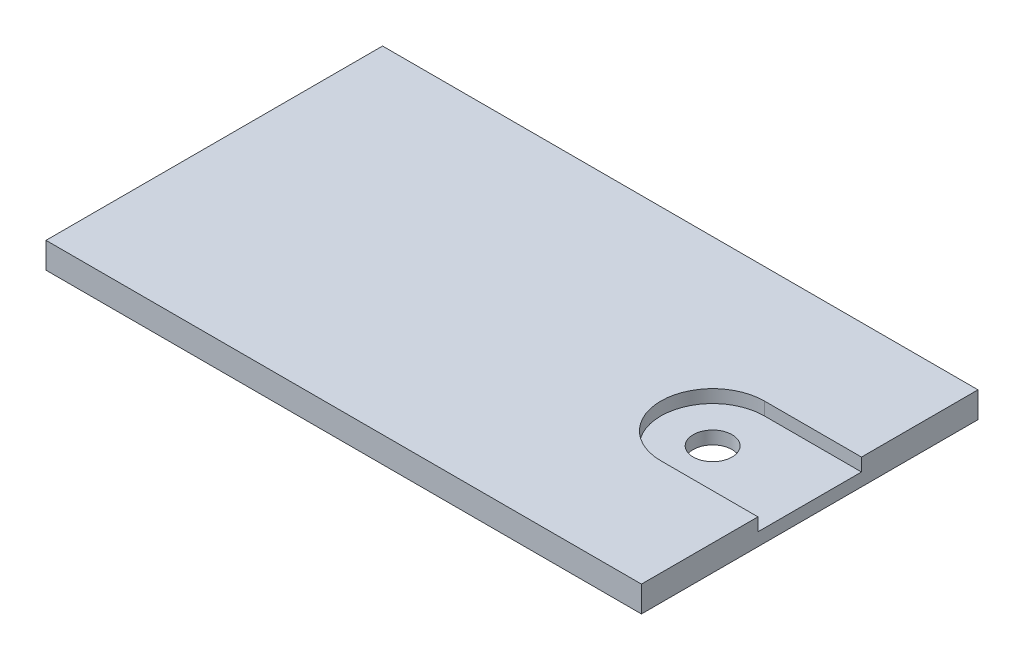
ISO-10303-21;
HEADER;
FILE_DESCRIPTION(('STEP AP214'),'2;1');
FILE_NAME('part.step','',(''),(''),'','','');
FILE_SCHEMA(('AUTOMOTIVE_DESIGN { 1 0 10303 214 1 1 1 1 }'));
ENDSEC;
DATA;
#1=APPLICATION_CONTEXT('core data for automotive mechanical design processes');
#2=APPLICATION_PROTOCOL_DEFINITION('international standard','automotive_design',2000,#1);
#3=PRODUCT_CONTEXT('',#1,'mechanical');
#4=PRODUCT('Part','Part','',(#3));
#5=PRODUCT_RELATED_PRODUCT_CATEGORY('part','',(#4));
#6=PRODUCT_DEFINITION_FORMATION('','',#4);
#7=PRODUCT_DEFINITION_CONTEXT('part definition',#1,'design');
#8=PRODUCT_DEFINITION('design','',#6,#7);
#9=PRODUCT_DEFINITION_SHAPE('','',#8);
#10=(LENGTH_UNIT() NAMED_UNIT(*) SI_UNIT(.MILLI.,.METRE.));
#11=(NAMED_UNIT(*) PLANE_ANGLE_UNIT() SI_UNIT($,.RADIAN.));
#12=(NAMED_UNIT(*) SI_UNIT($,.STERADIAN.) SOLID_ANGLE_UNIT());
#13=UNCERTAINTY_MEASURE_WITH_UNIT(LENGTH_MEASURE(1.E-05),#10,'distance_accuracy_value','');
#14=(GEOMETRIC_REPRESENTATION_CONTEXT(3) GLOBAL_UNCERTAINTY_ASSIGNED_CONTEXT((#13)) GLOBAL_UNIT_ASSIGNED_CONTEXT((#10,
#11,#12)) REPRESENTATION_CONTEXT('',''));
#15=CARTESIAN_POINT('',(0.,0.,0.));
#16=DIRECTION('',(0.,0.,1.));
#17=DIRECTION('',(1.,0.,0.));
#18=AXIS2_PLACEMENT_3D('',#15,#16,#17);
#19=CARTESIAN_POINT('',(0.,2.,0.));
#20=DIRECTION('',(1.,0.,0.));
#21=DIRECTION('',(0.,0.,-1.));
#22=AXIS2_PLACEMENT_3D('',#19,#20,#21);
#23=PLANE('',#22);
#24=DIRECTION('',(0.,0.,1.));
#25=VECTOR('',#24,1.);
#26=CARTESIAN_POINT('',(0.,0.,0.));
#27=LINE('',#26,#25);
#28=CARTESIAN_POINT('',(0.,0.,-26.));
#29=VERTEX_POINT('',#28);
#30=CARTESIAN_POINT('',(0.,0.,0.));
#31=VERTEX_POINT('',#30);
#32=EDGE_CURVE('E156',#29,#31,#27,.T.);
#33=ORIENTED_EDGE('',*,*,#32,.T.);
#34=DIRECTION('',(0.,-1.,0.));
#35=VECTOR('',#34,1.);
#36=CARTESIAN_POINT('',(0.,2.,0.));
#37=LINE('',#36,#35);
#38=CARTESIAN_POINT('',(0.,2.,0.));
#39=VERTEX_POINT('',#38);
#40=EDGE_CURVE('E190',#39,#31,#37,.T.);
#41=ORIENTED_EDGE('',*,*,#40,.F.);
#42=DIRECTION('',(0.,0.,1.));
#43=VECTOR('',#42,1.);
#44=CARTESIAN_POINT('',(0.,2.,0.));
#45=LINE('',#44,#43);
#46=CARTESIAN_POINT('',(0.,2.,-26.));
#47=VERTEX_POINT('',#46);
#48=EDGE_CURVE('E157',#47,#39,#45,.T.);
#49=ORIENTED_EDGE('',*,*,#48,.F.);
#50=DIRECTION('',(0.,-1.,0.));
#51=VECTOR('',#50,1.);
#52=CARTESIAN_POINT('',(0.,2.,-26.));
#53=LINE('',#52,#51);
#54=EDGE_CURVE('E169',#47,#29,#53,.T.);
#55=ORIENTED_EDGE('',*,*,#54,.T.);
#56=EDGE_LOOP('',(#33,#41,#49,#55));
#57=FACE_BOUND('',#56,.T.);
#58=ADVANCED_FACE('F39',(#57),#23,.F.);
#59=CARTESIAN_POINT('',(0.,2.,0.));
#60=DIRECTION('',(0.,0.,-1.));
#61=DIRECTION('',(-1.,0.,0.));
#62=AXIS2_PLACEMENT_3D('',#59,#60,#61);
#63=PLANE('',#62);
#64=DIRECTION('',(1.,0.,0.));
#65=VECTOR('',#64,1.);
#66=CARTESIAN_POINT('',(0.,0.,0.));
#67=LINE('',#66,#65);
#68=CARTESIAN_POINT('',(46.,0.,0.));
#69=VERTEX_POINT('',#68);
#70=EDGE_CURVE('E173',#31,#69,#67,.T.);
#71=ORIENTED_EDGE('',*,*,#70,.T.);
#72=DIRECTION('',(0.,-1.,0.));
#73=VECTOR('',#72,1.);
#74=CARTESIAN_POINT('',(46.,2.,0.));
#75=LINE('',#74,#73);
#76=CARTESIAN_POINT('',(46.,2.,0.));
#77=VERTEX_POINT('',#76);
#78=EDGE_CURVE('E186',#77,#69,#75,.T.);
#79=ORIENTED_EDGE('',*,*,#78,.F.);
#80=DIRECTION('',(1.,0.,0.));
#81=VECTOR('',#80,1.);
#82=CARTESIAN_POINT('',(0.,2.,0.));
#83=LINE('',#82,#81);
#84=EDGE_CURVE('E92',#39,#77,#83,.T.);
#85=ORIENTED_EDGE('',*,*,#84,.F.);
#86=ORIENTED_EDGE('',*,*,#40,.T.);
#87=EDGE_LOOP('',(#71,#79,#85,#86));
#88=FACE_BOUND('',#87,.T.);
#89=ADVANCED_FACE('F208',(#88),#63,.F.);
#90=CARTESIAN_POINT('',(46.,2.,0.));
#91=DIRECTION('',(-1.,0.,0.));
#92=DIRECTION('',(0.,0.,1.));
#93=AXIS2_PLACEMENT_3D('',#90,#91,#92);
#94=PLANE('',#93);
#95=DIRECTION('',(0.,0.,-1.));
#96=VECTOR('',#95,1.);
#97=CARTESIAN_POINT('',(46.,2.,0.));
#98=LINE('',#97,#96);
#99=CARTESIAN_POINT('',(46.,2.,-17.));
#100=VERTEX_POINT('',#99);
#101=CARTESIAN_POINT('',(46.,2.,-26.));
#102=VERTEX_POINT('',#101);
#103=EDGE_CURVE('E162',#100,#102,#98,.T.);
#104=ORIENTED_EDGE('',*,*,#103,.F.);
#105=DIRECTION('',(0.,-1.,0.));
#106=VECTOR('',#105,1.);
#107=CARTESIAN_POINT('',(46.,2.,-17.));
#108=LINE('',#107,#106);
#109=CARTESIAN_POINT('',(46.,1.,-17.));
#110=VERTEX_POINT('',#109);
#111=EDGE_CURVE('E152',#100,#110,#108,.T.);
#112=ORIENTED_EDGE('',*,*,#111,.T.);
#113=DIRECTION('',(0.,0.,-1.));
#114=VECTOR('',#113,1.);
#115=CARTESIAN_POINT('',(46.,1.,0.));
#116=LINE('',#115,#114);
#117=CARTESIAN_POINT('',(46.,1.,-9.));
#118=VERTEX_POINT('',#117);
#119=EDGE_CURVE('E11',#118,#110,#116,.T.);
#120=ORIENTED_EDGE('',*,*,#119,.F.);
#121=DIRECTION('',(0.,1.,0.));
#122=VECTOR('',#121,1.);
#123=CARTESIAN_POINT('',(46.,2.,-9.));
#124=LINE('',#123,#122);
#125=CARTESIAN_POINT('',(46.,2.,-9.));
#126=VERTEX_POINT('',#125);
#127=EDGE_CURVE('E127',#118,#126,#124,.T.);
#128=ORIENTED_EDGE('',*,*,#127,.T.);
#129=EDGE_CURVE('E163',#77,#126,#98,.T.);
#130=ORIENTED_EDGE('',*,*,#129,.F.);
#131=ORIENTED_EDGE('',*,*,#78,.T.);
#132=DIRECTION('',(0.,0.,-1.));
#133=VECTOR('',#132,1.);
#134=CARTESIAN_POINT('',(46.,0.,0.));
#135=LINE('',#134,#133);
#136=CARTESIAN_POINT('',(46.,0.,-26.));
#137=VERTEX_POINT('',#136);
#138=EDGE_CURVE('E176',#69,#137,#135,.T.);
#139=ORIENTED_EDGE('',*,*,#138,.T.);
#140=DIRECTION('',(0.,-1.,0.));
#141=VECTOR('',#140,1.);
#142=CARTESIAN_POINT('',(46.,2.,-26.));
#143=LINE('',#142,#141);
#144=EDGE_CURVE('E183',#102,#137,#143,.T.);
#145=ORIENTED_EDGE('',*,*,#144,.F.);
#146=EDGE_LOOP('',(#104,#112,#120,#128,#130,#131,#139,#145));
#147=FACE_BOUND('',#146,.T.);
#148=ADVANCED_FACE('F199',(#147),#94,.F.);
#149=CARTESIAN_POINT('',(0.,2.,-26.));
#150=DIRECTION('',(0.,0.,1.));
#151=DIRECTION('',(1.,0.,0.));
#152=AXIS2_PLACEMENT_3D('',#149,#150,#151);
#153=PLANE('',#152);
#154=DIRECTION('',(-1.,0.,0.));
#155=VECTOR('',#154,1.);
#156=CARTESIAN_POINT('',(0.,0.,-26.));
#157=LINE('',#156,#155);
#158=EDGE_CURVE('E84',#137,#29,#157,.T.);
#159=ORIENTED_EDGE('',*,*,#158,.T.);
#160=ORIENTED_EDGE('',*,*,#54,.F.);
#161=DIRECTION('',(-1.,0.,0.));
#162=VECTOR('',#161,1.);
#163=CARTESIAN_POINT('',(0.,2.,-26.));
#164=LINE('',#163,#162);
#165=EDGE_CURVE('E63',#102,#47,#164,.T.);
#166=ORIENTED_EDGE('',*,*,#165,.F.);
#167=ORIENTED_EDGE('',*,*,#144,.T.);
#168=EDGE_LOOP('',(#159,#160,#166,#167));
#169=FACE_BOUND('',#168,.T.);
#170=ADVANCED_FACE('F202',(#169),#153,.F.);
#171=CARTESIAN_POINT('',(0.,2.,0.));
#172=DIRECTION('',(0.,-1.,0.));
#173=DIRECTION('',(0.,0.,-1.));
#174=AXIS2_PLACEMENT_3D('',#171,#172,#173);
#175=PLANE('',#174);
#176=CARTESIAN_POINT('',(38.5,2.,-13.));
#177=DIRECTION('',(0.,1.,0.));
#178=DIRECTION('',(0.,0.,1.));
#179=AXIS2_PLACEMENT_3D('',#176,#177,#178);
#180=CIRCLE('',#179,4.);
#181=CARTESIAN_POINT('',(38.5,2.,-17.));
#182=VERTEX_POINT('',#181);
#183=CARTESIAN_POINT('',(38.5,2.,-9.));
#184=VERTEX_POINT('',#183);
#185=EDGE_CURVE('E54',#182,#184,#180,.T.);
#186=ORIENTED_EDGE('',*,*,#185,.F.);
#187=DIRECTION('',(1.,0.,0.));
#188=VECTOR('',#187,1.);
#189=CARTESIAN_POINT('',(0.,2.,-17.));
#190=LINE('',#189,#188);
#191=EDGE_CURVE('E47',#182,#100,#190,.T.);
#192=ORIENTED_EDGE('',*,*,#191,.T.);
#193=ORIENTED_EDGE('',*,*,#103,.T.);
#194=ORIENTED_EDGE('',*,*,#165,.T.);
#195=ORIENTED_EDGE('',*,*,#48,.T.);
#196=ORIENTED_EDGE('',*,*,#84,.T.);
#197=ORIENTED_EDGE('',*,*,#129,.T.);
#198=DIRECTION('',(1.,0.,0.));
#199=VECTOR('',#198,1.);
#200=CARTESIAN_POINT('',(38.5,2.,-9.));
#201=LINE('',#200,#199);
#202=EDGE_CURVE('E136',#184,#126,#201,.T.);
#203=ORIENTED_EDGE('',*,*,#202,.F.);
#204=EDGE_LOOP('',(#186,#192,#193,#194,#195,#196,#197,#203));
#205=FACE_BOUND('',#204,.T.);
#206=ADVANCED_FACE('F195',(#205),#175,.F.);
#207=CARTESIAN_POINT('',(0.,0.,0.));
#208=DIRECTION('',(0.,-1.,0.));
#209=DIRECTION('',(0.,0.,-1.));
#210=AXIS2_PLACEMENT_3D('',#207,#208,#209);
#211=PLANE('',#210);
#212=CARTESIAN_POINT('',(38.5,0.,-13.));
#213=DIRECTION('',(0.,-1.,0.));
#214=DIRECTION('',(0.,0.,-1.));
#215=AXIS2_PLACEMENT_3D('',#212,#213,#214);
#216=CIRCLE('',#215,1.49999999999999);
#217=CARTESIAN_POINT('',(38.5,0.,-14.5));
#218=VERTEX_POINT('',#217);
#219=EDGE_CURVE('E141',#218,#218,#216,.T.);
#220=ORIENTED_EDGE('',*,*,#219,.F.);
#221=EDGE_LOOP('',(#220));
#222=FACE_BOUND('',#221,.T.);
#223=ORIENTED_EDGE('',*,*,#32,.F.);
#224=ORIENTED_EDGE('',*,*,#158,.F.);
#225=ORIENTED_EDGE('',*,*,#138,.F.);
#226=ORIENTED_EDGE('',*,*,#70,.F.);
#227=EDGE_LOOP('',(#223,#224,#225,#226));
#228=FACE_BOUND('',#227,.T.);
#229=ADVANCED_FACE('F217',(#222,#228),#211,.T.);
#230=CARTESIAN_POINT('',(38.5,1.,-13.));
#231=DIRECTION('',(0.,1.,0.));
#232=DIRECTION('',(0.,0.,1.));
#233=AXIS2_PLACEMENT_3D('',#230,#231,#232);
#234=PLANE('',#233);
#235=CARTESIAN_POINT('',(38.5,1.,-13.));
#236=DIRECTION('',(0.,1.,0.));
#237=DIRECTION('',(0.,0.,1.));
#238=AXIS2_PLACEMENT_3D('',#235,#236,#237);
#239=CIRCLE('',#238,1.49999999999999);
#240=CARTESIAN_POINT('',(38.5,1.,-11.5));
#241=VERTEX_POINT('',#240);
#242=EDGE_CURVE('E248',#241,#241,#239,.T.);
#243=ORIENTED_EDGE('',*,*,#242,.F.);
#244=EDGE_LOOP('',(#243));
#245=FACE_BOUND('',#244,.T.);
#246=ORIENTED_EDGE('',*,*,#119,.T.);
#247=DIRECTION('',(-1.,0.,0.));
#248=VECTOR('',#247,1.);
#249=CARTESIAN_POINT('',(38.5,1.,-17.));
#250=LINE('',#249,#248);
#251=CARTESIAN_POINT('',(38.5,1.,-17.));
#252=VERTEX_POINT('',#251);
#253=EDGE_CURVE('E121',#110,#252,#250,.T.);
#254=ORIENTED_EDGE('',*,*,#253,.T.);
#255=CARTESIAN_POINT('',(38.5,1.,-13.));
#256=DIRECTION('',(0.,1.,0.));
#257=DIRECTION('',(0.,0.,1.));
#258=AXIS2_PLACEMENT_3D('',#255,#256,#257);
#259=CIRCLE('',#258,4.);
#260=CARTESIAN_POINT('',(38.5,1.,-9.));
#261=VERTEX_POINT('',#260);
#262=EDGE_CURVE('E116',#252,#261,#259,.T.);
#263=ORIENTED_EDGE('',*,*,#262,.T.);
#264=DIRECTION('',(1.,0.,0.));
#265=VECTOR('',#264,1.);
#266=CARTESIAN_POINT('',(38.5,1.,-9.));
#267=LINE('',#266,#265);
#268=EDGE_CURVE('E124',#261,#118,#267,.T.);
#269=ORIENTED_EDGE('',*,*,#268,.T.);
#270=EDGE_LOOP('',(#246,#254,#263,#269));
#271=FACE_BOUND('',#270,.T.);
#272=ADVANCED_FACE('F132',(#245,#271),#234,.T.);
#273=CARTESIAN_POINT('',(38.5,1.,-17.));
#274=DIRECTION('',(0.,0.,-1.));
#275=DIRECTION('',(-1.,0.,0.));
#276=AXIS2_PLACEMENT_3D('',#273,#274,#275);
#277=PLANE('',#276);
#278=ORIENTED_EDGE('',*,*,#191,.F.);
#279=DIRECTION('',(0.,1.,0.));
#280=VECTOR('',#279,1.);
#281=CARTESIAN_POINT('',(38.5,1.,-17.));
#282=LINE('',#281,#280);
#283=EDGE_CURVE('E120',#252,#182,#282,.T.);
#284=ORIENTED_EDGE('',*,*,#283,.F.);
#285=ORIENTED_EDGE('',*,*,#253,.F.);
#286=ORIENTED_EDGE('',*,*,#111,.F.);
#287=EDGE_LOOP('',(#278,#284,#285,#286));
#288=FACE_BOUND('',#287,.T.);
#289=ADVANCED_FACE('F209',(#288),#277,.F.);
#290=CARTESIAN_POINT('',(38.5,1.,-9.));
#291=DIRECTION('',(0.,0.,1.));
#292=DIRECTION('',(1.,0.,0.));
#293=AXIS2_PLACEMENT_3D('',#290,#291,#292);
#294=PLANE('',#293);
#295=ORIENTED_EDGE('',*,*,#268,.F.);
#296=DIRECTION('',(0.,1.,0.));
#297=VECTOR('',#296,1.);
#298=CARTESIAN_POINT('',(38.5,1.,-9.));
#299=LINE('',#298,#297);
#300=EDGE_CURVE('E112',#261,#184,#299,.T.);
#301=ORIENTED_EDGE('',*,*,#300,.T.);
#302=ORIENTED_EDGE('',*,*,#202,.T.);
#303=ORIENTED_EDGE('',*,*,#127,.F.);
#304=EDGE_LOOP('',(#295,#301,#302,#303));
#305=FACE_BOUND('',#304,.T.);
#306=ADVANCED_FACE('F125',(#305),#294,.F.);
#307=CARTESIAN_POINT('',(38.5,1.,-13.));
#308=DIRECTION('',(0.,1.,0.));
#309=DIRECTION('',(0.,0.,1.));
#310=AXIS2_PLACEMENT_3D('',#307,#308,#309);
#311=CYLINDRICAL_SURFACE('',#310,4.);
#312=ORIENTED_EDGE('',*,*,#185,.T.);
#313=ORIENTED_EDGE('',*,*,#300,.F.);
#314=ORIENTED_EDGE('',*,*,#262,.F.);
#315=ORIENTED_EDGE('',*,*,#283,.T.);
#316=EDGE_LOOP('',(#312,#313,#314,#315));
#317=FACE_BOUND('',#316,.T.);
#318=ADVANCED_FACE('F114',(#317),#311,.F.);
#319=CARTESIAN_POINT('',(38.5,1.,-13.));
#320=DIRECTION('',(0.,1.,0.));
#321=DIRECTION('',(0.,0.,1.));
#322=AXIS2_PLACEMENT_3D('',#319,#320,#321);
#323=CYLINDRICAL_SURFACE('',#322,1.49999999999999);
#324=ORIENTED_EDGE('',*,*,#242,.T.);
#325=EDGE_LOOP('',(#324));
#326=FACE_BOUND('',#325,.T.);
#327=ORIENTED_EDGE('',*,*,#219,.T.);
#328=EDGE_LOOP('',(#327));
#329=FACE_BOUND('',#328,.T.);
#330=ADVANCED_FACE('F237',(#326,#329),#323,.F.);
#331=CLOSED_SHELL('',(#58,#89,#148,#170,#206,#229,#272,#289,#306,#318,#330));
#332=MANIFOLD_SOLID_BREP('B2',#331);
#333=ADVANCED_BREP_SHAPE_REPRESENTATION('',(#18,#332),#14);
#334=SHAPE_DEFINITION_REPRESENTATION(#9,#333);
ENDSEC;
END-ISO-10303-21;
